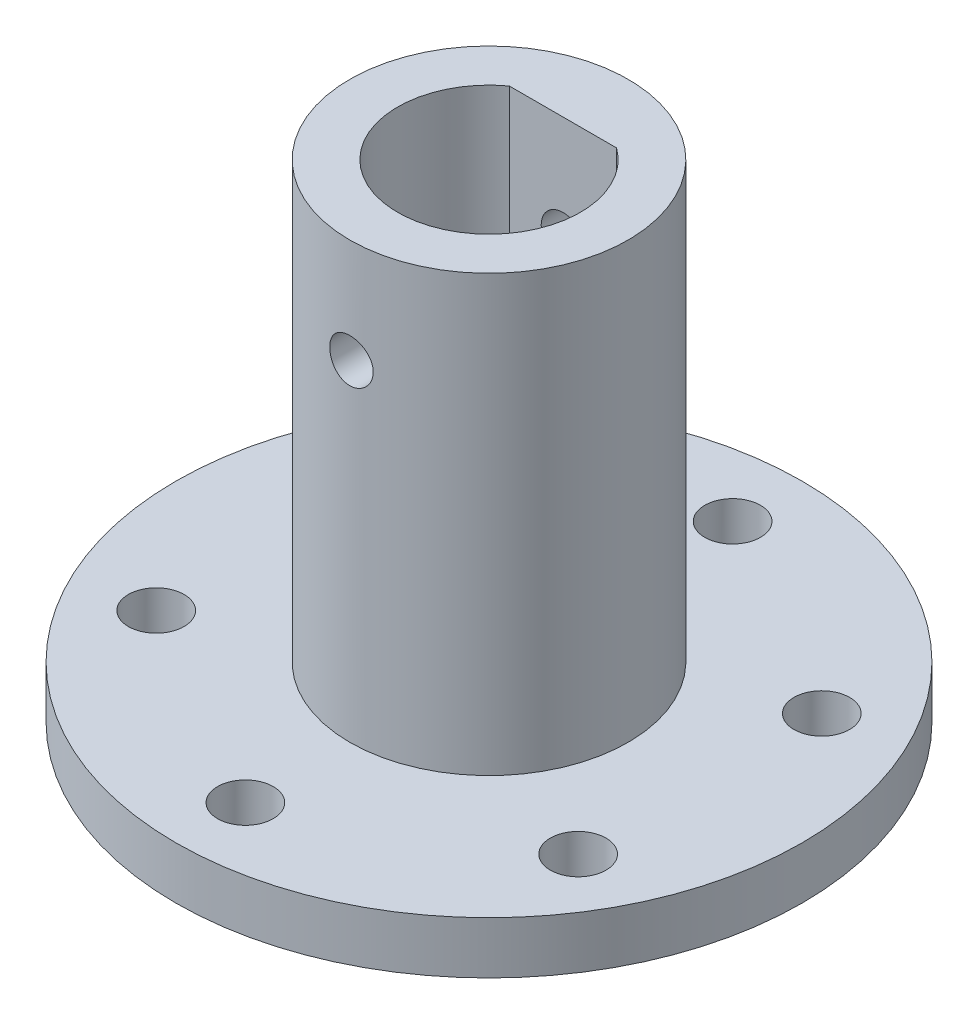
ISO-10303-21;
HEADER;
FILE_DESCRIPTION(('STEP AP214'),'2;1');
FILE_NAME('part.step','',(''),(''),'','','');
FILE_SCHEMA(('AUTOMOTIVE_DESIGN { 1 0 10303 214 1 1 1 1 }'));
ENDSEC;
DATA;
#1=APPLICATION_CONTEXT('core data for automotive mechanical design processes');
#2=APPLICATION_PROTOCOL_DEFINITION('international standard','automotive_design',2000,#1);
#3=PRODUCT_CONTEXT('',#1,'mechanical');
#4=PRODUCT('Part','Part','',(#3));
#5=PRODUCT_RELATED_PRODUCT_CATEGORY('part','',(#4));
#6=PRODUCT_DEFINITION_FORMATION('','',#4);
#7=PRODUCT_DEFINITION_CONTEXT('part definition',#1,'design');
#8=PRODUCT_DEFINITION('design','',#6,#7);
#9=PRODUCT_DEFINITION_SHAPE('','',#8);
#10=(LENGTH_UNIT() NAMED_UNIT(*) SI_UNIT(.MILLI.,.METRE.));
#11=(NAMED_UNIT(*) PLANE_ANGLE_UNIT() SI_UNIT($,.RADIAN.));
#12=(NAMED_UNIT(*) SI_UNIT($,.STERADIAN.) SOLID_ANGLE_UNIT());
#13=UNCERTAINTY_MEASURE_WITH_UNIT(LENGTH_MEASURE(1.E-05),#10,'distance_accuracy_value','');
#14=(GEOMETRIC_REPRESENTATION_CONTEXT(3) GLOBAL_UNCERTAINTY_ASSIGNED_CONTEXT((#13)) GLOBAL_UNIT_ASSIGNED_CONTEXT((#10,
#11,#12)) REPRESENTATION_CONTEXT('',''));
#15=CARTESIAN_POINT('',(0.,0.,0.));
#16=DIRECTION('',(0.,0.,1.));
#17=DIRECTION('',(1.,0.,0.));
#18=AXIS2_PLACEMENT_3D('',#15,#16,#17);
#19=CARTESIAN_POINT('',(0.,12.8439325113563,0.));
#20=DIRECTION('',(0.,1.,0.));
#21=DIRECTION('',(0.,0.,1.));
#22=AXIS2_PLACEMENT_3D('',#19,#20,#21);
#23=CYLINDRICAL_SURFACE('',#22,5.25);
#24=CARTESIAN_POINT('',(-1.24999999999999,22.,5.09901951359279));
#25=CARTESIAN_POINT('',(-1.24999785885748,22.0691367366812,5.09902088312665));
#26=CARTESIAN_POINT('',(-1.24424460502481,22.1382979366956,5.10044097404398));
#27=CARTESIAN_POINT('',(-1.22141569373253,22.2746418867641,5.10595502478239));
#28=CARTESIAN_POINT('',(-1.20433282053127,22.3418233474402,5.11005068862898));
#29=CARTESIAN_POINT('',(-1.15942266716621,22.4722159647704,5.12042632881042));
#30=CARTESIAN_POINT('',(-1.13160842896905,22.5354318328592,5.12670365283029));
#31=CARTESIAN_POINT('',(-1.06606393450019,22.6563047919484,5.14073206322753));
#32=CARTESIAN_POINT('',(-1.02833350066956,22.7139617833866,5.1484831759938));
#33=CARTESIAN_POINT('',(-0.943223109329419,22.8232324282917,5.16475903740231));
#34=CARTESIAN_POINT('',(-0.895681783952359,22.8747187176401,5.17329519422943));
#35=CARTESIAN_POINT('',(-0.792647034494901,22.96906700768,5.19008001857373));
#36=CARTESIAN_POINT('',(-0.737152919242241,23.0119282579953,5.19832866102566));
#37=CARTESIAN_POINT('',(-0.618922605539102,23.0883240871133,5.21373451513865));
#38=CARTESIAN_POINT('',(-0.556104094770733,23.1217345725256,5.22087669359737));
#39=CARTESIAN_POINT('',(-0.42554470351986,23.1774752128776,5.23313524630461));
#40=CARTESIAN_POINT('',(-0.35780448133219,23.1998068465333,5.23825189088664));
#41=CARTESIAN_POINT('',(-0.220651076167159,23.2323508153051,5.24580223262853));
#42=CARTESIAN_POINT('',(-0.151291823574655,23.2427791641291,5.24828369162804));
#43=CARTESIAN_POINT('',(-0.0117669026683149,23.2518975388049,5.25045012977004));
#44=CARTESIAN_POINT('',(0.0583986558104505,23.2505891449427,5.25013548539208));
#45=CARTESIAN_POINT('',(0.196049861550258,23.2364287235743,5.24678109833222));
#46=CARTESIAN_POINT('',(0.263561021569532,23.2238097256917,5.24379636914813));
#47=CARTESIAN_POINT('',(0.3954787610445,23.1877595901311,5.23550067625341));
#48=CARTESIAN_POINT('',(0.459885184145744,23.1643279085537,5.23018959552336));
#49=CARTESIAN_POINT('',(0.584392107067303,23.1071221298941,5.21775208111387));
#50=CARTESIAN_POINT('',(0.644451986255137,23.0732629828094,5.21061080322669));
#51=CARTESIAN_POINT('',(0.758120393347277,22.9962274666705,5.19529092235459));
#52=CARTESIAN_POINT('',(0.811727891330245,22.9530496132396,5.18711215419351));
#53=CARTESIAN_POINT('',(0.912358316897823,22.8573452491013,5.1703744370168));
#54=CARTESIAN_POINT('',(0.959186878562004,22.8046149345126,5.16181108488179));
#55=CARTESIAN_POINT('',(1.04337725172811,22.6919601234376,5.1454551339672));
#56=CARTESIAN_POINT('',(1.08073870091729,22.6320353517438,5.13766256469295));
#57=CARTESIAN_POINT('',(1.14504336945339,22.5063381575573,5.12371620404311));
#58=CARTESIAN_POINT('',(1.17194381298966,22.4405430504215,5.11756917263967));
#59=CARTESIAN_POINT('',(1.21424387111501,22.3051836670014,5.10769895823854));
#60=CARTESIAN_POINT('',(1.22964569002253,22.2356201158823,5.10397531068897));
#61=CARTESIAN_POINT('',(1.2481971982285,22.0964905777367,5.09946992286998));
#62=CARTESIAN_POINT('',(1.2516325382156,22.0269648546118,5.09861960859703));
#63=CARTESIAN_POINT('',(1.2469321889561,21.888333880587,5.099771162733));
#64=CARTESIAN_POINT('',(1.23879745592381,21.8192285954139,5.10177279544141));
#65=CARTESIAN_POINT('',(1.21143734261675,21.6844344220933,5.10833736996044));
#66=CARTESIAN_POINT('',(1.19237468740761,21.6187105006146,5.11286270561253));
#67=CARTESIAN_POINT('',(1.14387857869202,21.4913902483851,5.1239297940766));
#68=CARTESIAN_POINT('',(1.11444398675801,21.4297943716138,5.13047176822569));
#69=CARTESIAN_POINT('',(1.04542931678653,21.3112581266234,5.14498187339137));
#70=CARTESIAN_POINT('',(1.00567640317636,21.2544213283187,5.15297352334474));
#71=CARTESIAN_POINT('',(0.917375042921344,21.1481203354314,5.16942315260144));
#72=CARTESIAN_POINT('',(0.86882529116395,21.0986572368098,5.17788120097065));
#73=CARTESIAN_POINT('',(0.763004603880882,21.0073698092285,5.19454051999405));
#74=CARTESIAN_POINT('',(0.705562297885568,20.9657419741736,5.20273175833321));
#75=CARTESIAN_POINT('',(0.584335590875846,20.8927250616461,5.21773672625508));
#76=CARTESIAN_POINT('',(0.520551510554952,20.8613354667851,5.22455052543991));
#77=CARTESIAN_POINT('',(0.388879861048126,20.8099449619625,5.23599127964168));
#78=CARTESIAN_POINT('',(0.321024383181234,20.7898653405245,5.24063330969237));
#79=CARTESIAN_POINT('',(0.182778339218192,20.7614242197581,5.24727319347292));
#80=CARTESIAN_POINT('',(0.112388216287992,20.7530606820561,5.24927150715531));
#81=CARTESIAN_POINT('',(-0.0270756431727823,20.748394796593,5.25038204287669));
#82=CARTESIAN_POINT('',(-0.09613923562342,20.7518011856621,5.24956396233935));
#83=CARTESIAN_POINT('',(-0.232679577449816,20.7699175171118,5.24528611702384));
#84=CARTESIAN_POINT('',(-0.300156366191006,20.7846271787751,5.24182641785037));
#85=CARTESIAN_POINT('',(-0.431334040661579,20.8247825450282,5.2326626786926));
#86=CARTESIAN_POINT('',(-0.495050440287695,20.8501800208825,5.22696872846421));
#87=CARTESIAN_POINT('',(-0.617352666012316,20.9109454115221,5.21393924600207));
#88=CARTESIAN_POINT('',(-0.675937899517231,20.9463144759321,5.20660352450859));
#89=CARTESIAN_POINT('',(-0.787711991034067,21.0269316531883,5.19088322365525));
#90=CARTESIAN_POINT('',(-0.84075346295058,21.0723803104889,5.18247909165065));
#91=CARTESIAN_POINT('',(-0.938556010634076,21.1714711201647,5.16566363060175));
#92=CARTESIAN_POINT('',(-0.983315030309046,21.2251153010346,5.15725230028973));
#93=CARTESIAN_POINT('',(-1.06400228282944,21.3401397238019,5.14121809211461));
#94=CARTESIAN_POINT('',(-1.09977263989504,21.4016329957493,5.133610511856));
#95=CARTESIAN_POINT('',(-1.16041397113455,21.5299305327622,5.12024517767835));
#96=CARTESIAN_POINT('',(-1.18529339784416,21.5967306314129,5.11448599013699));
#97=CARTESIAN_POINT('',(-1.21944694976979,21.7195762626946,5.10643579215713));
#98=CARTESIAN_POINT('',(-1.23088059691461,21.7750005851223,5.10367460869863));
#99=CARTESIAN_POINT('',(-1.24615773525109,21.8869445361297,5.0999659721163));
#100=CARTESIAN_POINT('',(-1.25000175089899,21.9434640887548,5.09901839366945));
#101=CARTESIAN_POINT('',(-1.24999999999999,22.,5.09901951359279));
#102=B_SPLINE_CURVE_WITH_KNOTS('',3,(#24,#25,#26,#27,#28,#29,#30,#31,#32,#33,#34,#35,#36,#37,
#38,#39,#40,#41,#42,#43,#44,#45,#46,#47,#48,#49,#50,#51,#52,#53,#54,#55,#56,#57,#58,#59,#60,#61,
#62,#63,#64,#65,#66,#67,#68,#69,#70,#71,#72,#73,#74,#75,#76,#77,#78,#79,#80,#81,#82,#83,#84,#85,
#86,#87,#88,#89,#90,#91,#92,#93,#94,#95,#96,#97,#98,#99,#100,#101),.UNSPECIFIED.,.T.,.F.,(4,2,2,
2,2,2,2,2,2,2,2,2,2,2,2,2,2,2,2,2,2,2,2,2,2,2,2,2,2,2,2,2,2,2,2,2,2,2,4),(0.,0.207202765184714,
0.414537623001906,0.621621293782812,0.828708672846365,1.03952115472002,1.25035196930542,
1.46383464640929,1.67728882189395,1.88680449583212,2.09629196009313,2.30156016379188,
2.50683869401434,2.71383799549589,2.92087029426312,3.13299433877604,3.34512650019262,
3.55811718660246,3.7710670316113,3.97889736743139,4.18671052801054,4.3915067218453,
4.59632540119041,4.80482526343989,5.0133560844185,5.2265699873704,5.43977311391033,
5.65147352089867,5.86313709150271,6.0696006573055,6.27605909574461,6.4815957153281,
6.6871560409301,6.89724669770571,7.10738943904514,7.32099917179347,7.53444282516285,
7.70389263250655,7.87333073017472),.UNSPECIFIED.);
#103=CARTESIAN_POINT('',(-1.24999999999999,22.,5.09901951359279));
#104=VERTEX_POINT('',#103);
#105=EDGE_CURVE('E87',#104,#104,#102,.T.);
#106=ORIENTED_EDGE('',*,*,#105,.F.);
#107=EDGE_LOOP('',(#106));
#108=FACE_BOUND('',#107,.T.);
#109=DIRECTION('',(0.,1.,0.));
#110=VECTOR('',#109,1.);
#111=CARTESIAN_POINT('',(3.08220700148449,-6.2449979983984,-4.25));
#112=LINE('',#111,#110);
#113=CARTESIAN_POINT('',(3.08220700148449,0.,-4.25));
#114=VERTEX_POINT('',#113);
#115=CARTESIAN_POINT('',(3.08220700148449,28.,-4.25));
#116=VERTEX_POINT('',#115);
#117=EDGE_CURVE('E61',#114,#116,#112,.T.);
#118=ORIENTED_EDGE('',*,*,#117,.F.);
#119=CARTESIAN_POINT('',(0.,0.,0.));
#120=DIRECTION('',(0.,1.,0.));
#121=DIRECTION('',(0.,0.,1.));
#122=AXIS2_PLACEMENT_3D('',#119,#120,#121);
#123=CIRCLE('',#122,5.25);
#124=CARTESIAN_POINT('',(-3.08220700148449,0.,-4.25));
#125=VERTEX_POINT('',#124);
#126=EDGE_CURVE('E11',#125,#114,#123,.T.);
#127=ORIENTED_EDGE('',*,*,#126,.F.);
#128=DIRECTION('',(0.,1.,0.));
#129=VECTOR('',#128,1.);
#130=CARTESIAN_POINT('',(-3.08220700148449,-6.2449979983984,-4.25));
#131=LINE('',#130,#129);
#132=CARTESIAN_POINT('',(-3.08220700148449,28.,-4.25));
#133=VERTEX_POINT('',#132);
#134=EDGE_CURVE('E76',#125,#133,#131,.T.);
#135=ORIENTED_EDGE('',*,*,#134,.T.);
#136=CARTESIAN_POINT('',(0.,28.,0.));
#137=DIRECTION('',(0.,1.,0.));
#138=DIRECTION('',(0.,0.,1.));
#139=AXIS2_PLACEMENT_3D('',#136,#137,#138);
#140=CIRCLE('',#139,5.25);
#141=EDGE_CURVE('E68',#133,#116,#140,.T.);
#142=ORIENTED_EDGE('',*,*,#141,.T.);
#143=EDGE_LOOP('',(#118,#127,#135,#142));
#144=FACE_BOUND('',#143,.T.);
#145=ADVANCED_FACE('F36',(#108,#144),#23,.F.);
#146=CARTESIAN_POINT('',(-5.25,0.,0.));
#147=DIRECTION('',(0.,-1.,0.));
#148=DIRECTION('',(0.,0.,-1.));
#149=AXIS2_PLACEMENT_3D('',#146,#147,#148);
#150=PLANE('',#149);
#151=CARTESIAN_POINT('',(12.1243556529821,0.,-7.));
#152=DIRECTION('',(0.,-1.,0.));
#153=DIRECTION('',(0.,0.,-1.));
#154=AXIS2_PLACEMENT_3D('',#151,#152,#153);
#155=CIRCLE('',#154,1.6);
#156=CARTESIAN_POINT('',(12.1243556529821,0.,-8.60000000000001));
#157=VERTEX_POINT('',#156);
#158=EDGE_CURVE('E118',#157,#157,#155,.T.);
#159=ORIENTED_EDGE('',*,*,#158,.F.);
#160=EDGE_LOOP('',(#159));
#161=FACE_BOUND('',#160,.T.);
#162=CARTESIAN_POINT('',(12.1243556529821,0.,7.));
#163=DIRECTION('',(0.,-1.,0.));
#164=DIRECTION('',(0.,0.,-1.));
#165=AXIS2_PLACEMENT_3D('',#162,#163,#164);
#166=CIRCLE('',#165,1.6);
#167=CARTESIAN_POINT('',(12.1243556529821,0.,5.4));
#168=VERTEX_POINT('',#167);
#169=EDGE_CURVE('E115',#168,#168,#166,.T.);
#170=ORIENTED_EDGE('',*,*,#169,.F.);
#171=EDGE_LOOP('',(#170));
#172=FACE_BOUND('',#171,.T.);
#173=CARTESIAN_POINT('',(0.,0.,14.));
#174=DIRECTION('',(0.,-1.,0.));
#175=DIRECTION('',(0.,0.,-1.));
#176=AXIS2_PLACEMENT_3D('',#173,#174,#175);
#177=CIRCLE('',#176,1.6);
#178=CARTESIAN_POINT('',(0.,0.,12.4));
#179=VERTEX_POINT('',#178);
#180=EDGE_CURVE('E112',#179,#179,#177,.T.);
#181=ORIENTED_EDGE('',*,*,#180,.F.);
#182=EDGE_LOOP('',(#181));
#183=FACE_BOUND('',#182,.T.);
#184=CARTESIAN_POINT('',(-12.1243556529821,0.,7.00000000000001));
#185=DIRECTION('',(0.,-1.,0.));
#186=DIRECTION('',(0.,0.,-1.));
#187=AXIS2_PLACEMENT_3D('',#184,#185,#186);
#188=CIRCLE('',#187,1.6);
#189=CARTESIAN_POINT('',(-12.1243556529821,0.,5.4));
#190=VERTEX_POINT('',#189);
#191=EDGE_CURVE('E109',#190,#190,#188,.T.);
#192=ORIENTED_EDGE('',*,*,#191,.F.);
#193=EDGE_LOOP('',(#192));
#194=FACE_BOUND('',#193,.T.);
#195=CARTESIAN_POINT('',(-12.1243556529821,0.,-6.99999999999999));
#196=DIRECTION('',(0.,-1.,0.));
#197=DIRECTION('',(0.,0.,-1.));
#198=AXIS2_PLACEMENT_3D('',#195,#196,#197);
#199=CIRCLE('',#198,1.6);
#200=CARTESIAN_POINT('',(-12.1243556529821,0.,-8.59999999999999));
#201=VERTEX_POINT('',#200);
#202=EDGE_CURVE('E95',#201,#201,#199,.T.);
#203=ORIENTED_EDGE('',*,*,#202,.F.);
#204=EDGE_LOOP('',(#203));
#205=FACE_BOUND('',#204,.T.);
#206=CARTESIAN_POINT('',(0.,0.,-14.));
#207=DIRECTION('',(0.,-1.,0.));
#208=DIRECTION('',(0.,0.,-1.));
#209=AXIS2_PLACEMENT_3D('',#206,#207,#208);
#210=CIRCLE('',#209,1.6);
#211=CARTESIAN_POINT('',(0.,0.,-15.6));
#212=VERTEX_POINT('',#211);
#213=EDGE_CURVE('E73',#212,#212,#210,.T.);
#214=ORIENTED_EDGE('',*,*,#213,.F.);
#215=EDGE_LOOP('',(#214));
#216=FACE_BOUND('',#215,.T.);
#217=ORIENTED_EDGE('',*,*,#126,.T.);
#218=DIRECTION('',(1.,0.,0.));
#219=VECTOR('',#218,1.);
#220=CARTESIAN_POINT('',(-3.08220700148449,0.,-4.25));
#221=LINE('',#220,#219);
#222=EDGE_CURVE('E82',#125,#114,#221,.T.);
#223=ORIENTED_EDGE('',*,*,#222,.F.);
#224=EDGE_LOOP('',(#217,#223));
#225=FACE_BOUND('',#224,.T.);
#226=CARTESIAN_POINT('',(0.,0.,0.));
#227=DIRECTION('',(0.,1.,0.));
#228=DIRECTION('',(0.,0.,1.));
#229=AXIS2_PLACEMENT_3D('',#226,#227,#228);
#230=CIRCLE('',#229,18.);
#231=CARTESIAN_POINT('',(0.,0.,18.));
#232=VERTEX_POINT('',#231);
#233=EDGE_CURVE('E50',#232,#232,#230,.T.);
#234=ORIENTED_EDGE('',*,*,#233,.F.);
#235=EDGE_LOOP('',(#234));
#236=FACE_BOUND('',#235,.T.);
#237=ADVANCED_FACE('F180',(#161,#172,#183,#194,#205,#216,#225,#236),#150,.T.);
#238=CARTESIAN_POINT('',(0.,12.8439325113563,0.));
#239=DIRECTION('',(0.,1.,0.));
#240=DIRECTION('',(0.,0.,1.));
#241=AXIS2_PLACEMENT_3D('',#238,#239,#240);
#242=CYLINDRICAL_SURFACE('',#241,18.);
#243=ORIENTED_EDGE('',*,*,#233,.T.);
#244=EDGE_LOOP('',(#243));
#245=FACE_BOUND('',#244,.T.);
#246=CARTESIAN_POINT('',(0.,3.,0.));
#247=DIRECTION('',(0.,1.,0.));
#248=DIRECTION('',(0.,0.,1.));
#249=AXIS2_PLACEMENT_3D('',#246,#247,#248);
#250=CIRCLE('',#249,18.);
#251=CARTESIAN_POINT('',(0.,3.,18.));
#252=VERTEX_POINT('',#251);
#253=EDGE_CURVE('E131',#252,#252,#250,.T.);
#254=ORIENTED_EDGE('',*,*,#253,.F.);
#255=EDGE_LOOP('',(#254));
#256=FACE_BOUND('',#255,.T.);
#257=ADVANCED_FACE('F185',(#245,#256),#242,.T.);
#258=CARTESIAN_POINT('',(-18.,3.,0.));
#259=DIRECTION('',(0.,1.,0.));
#260=DIRECTION('',(0.,0.,1.));
#261=AXIS2_PLACEMENT_3D('',#258,#259,#260);
#262=PLANE('',#261);
#263=CARTESIAN_POINT('',(12.1243556529821,3.,-7.));
#264=DIRECTION('',(0.,1.,0.));
#265=DIRECTION('',(0.,0.,1.));
#266=AXIS2_PLACEMENT_3D('',#263,#264,#265);
#267=CIRCLE('',#266,1.6);
#268=CARTESIAN_POINT('',(12.1243556529821,3.,-5.4));
#269=VERTEX_POINT('',#268);
#270=EDGE_CURVE('E92',#269,#269,#267,.T.);
#271=ORIENTED_EDGE('',*,*,#270,.F.);
#272=EDGE_LOOP('',(#271));
#273=FACE_BOUND('',#272,.T.);
#274=CARTESIAN_POINT('',(12.1243556529821,3.,7.));
#275=DIRECTION('',(0.,1.,0.));
#276=DIRECTION('',(0.,0.,1.));
#277=AXIS2_PLACEMENT_3D('',#274,#275,#276);
#278=CIRCLE('',#277,1.6);
#279=CARTESIAN_POINT('',(12.1243556529821,3.,8.6));
#280=VERTEX_POINT('',#279);
#281=EDGE_CURVE('E96',#280,#280,#278,.T.);
#282=ORIENTED_EDGE('',*,*,#281,.F.);
#283=EDGE_LOOP('',(#282));
#284=FACE_BOUND('',#283,.T.);
#285=CARTESIAN_POINT('',(0.,3.,14.));
#286=DIRECTION('',(0.,1.,0.));
#287=DIRECTION('',(0.,0.,1.));
#288=AXIS2_PLACEMENT_3D('',#285,#286,#287);
#289=CIRCLE('',#288,1.6);
#290=CARTESIAN_POINT('',(0.,3.,15.6));
#291=VERTEX_POINT('',#290);
#292=EDGE_CURVE('E99',#291,#291,#289,.T.);
#293=ORIENTED_EDGE('',*,*,#292,.F.);
#294=EDGE_LOOP('',(#293));
#295=FACE_BOUND('',#294,.T.);
#296=CARTESIAN_POINT('',(-12.1243556529821,3.,7.00000000000001));
#297=DIRECTION('',(0.,1.,0.));
#298=DIRECTION('',(0.,0.,1.));
#299=AXIS2_PLACEMENT_3D('',#296,#297,#298);
#300=CIRCLE('',#299,1.6);
#301=CARTESIAN_POINT('',(-12.1243556529821,3.,8.60000000000001));
#302=VERTEX_POINT('',#301);
#303=EDGE_CURVE('E102',#302,#302,#300,.T.);
#304=ORIENTED_EDGE('',*,*,#303,.F.);
#305=EDGE_LOOP('',(#304));
#306=FACE_BOUND('',#305,.T.);
#307=CARTESIAN_POINT('',(-12.1243556529821,3.,-6.99999999999999));
#308=DIRECTION('',(0.,1.,0.));
#309=DIRECTION('',(0.,0.,1.));
#310=AXIS2_PLACEMENT_3D('',#307,#308,#309);
#311=CIRCLE('',#310,1.6);
#312=CARTESIAN_POINT('',(-12.1243556529821,3.,-5.39999999999999));
#313=VERTEX_POINT('',#312);
#314=EDGE_CURVE('E79',#313,#313,#311,.T.);
#315=ORIENTED_EDGE('',*,*,#314,.F.);
#316=EDGE_LOOP('',(#315));
#317=FACE_BOUND('',#316,.T.);
#318=CARTESIAN_POINT('',(0.,3.,-14.));
#319=DIRECTION('',(0.,1.,0.));
#320=DIRECTION('',(0.,0.,1.));
#321=AXIS2_PLACEMENT_3D('',#318,#319,#320);
#322=CIRCLE('',#321,1.6);
#323=CARTESIAN_POINT('',(0.,3.,-12.4));
#324=VERTEX_POINT('',#323);
#325=EDGE_CURVE('E121',#324,#324,#322,.T.);
#326=ORIENTED_EDGE('',*,*,#325,.F.);
#327=EDGE_LOOP('',(#326));
#328=FACE_BOUND('',#327,.T.);
#329=ORIENTED_EDGE('',*,*,#253,.T.);
#330=EDGE_LOOP('',(#329));
#331=FACE_BOUND('',#330,.T.);
#332=CARTESIAN_POINT('',(0.,3.,0.));
#333=DIRECTION('',(0.,1.,0.));
#334=DIRECTION('',(0.,0.,1.));
#335=AXIS2_PLACEMENT_3D('',#332,#333,#334);
#336=CIRCLE('',#335,8.);
#337=CARTESIAN_POINT('',(0.,3.,8.));
#338=VERTEX_POINT('',#337);
#339=EDGE_CURVE('E128',#338,#338,#336,.T.);
#340=ORIENTED_EDGE('',*,*,#339,.F.);
#341=EDGE_LOOP('',(#340));
#342=FACE_BOUND('',#341,.T.);
#343=ADVANCED_FACE('F164',(#273,#284,#295,#306,#317,#328,#331,#342),#262,.T.);
#344=CARTESIAN_POINT('',(0.,12.8439325113563,0.));
#345=DIRECTION('',(0.,1.,0.));
#346=DIRECTION('',(0.,0.,1.));
#347=AXIS2_PLACEMENT_3D('',#344,#345,#346);
#348=CYLINDRICAL_SURFACE('',#347,8.);
#349=CARTESIAN_POINT('',(0.,20.75,8.));
#350=CARTESIAN_POINT('',(0.0697575486355159,20.7500028491358,7.99999885097241));
#351=CARTESIAN_POINT('',(0.139554702432851,20.7558590568868,7.9990780624287));
#352=CARTESIAN_POINT('',(0.277195657489049,20.7791218456384,7.99549349048796));
#353=CARTESIAN_POINT('',(0.345037530661656,20.7965394462518,7.99282804422361));
#354=CARTESIAN_POINT('',(0.476756269023698,20.8423898314033,7.98605348582888));
#355=CARTESIAN_POINT('',(0.540636176144947,20.8708140406808,7.98194549781586));
#356=CARTESIAN_POINT('',(0.662710625522294,20.9378492725708,7.97273897019077));
#357=CARTESIAN_POINT('',(0.720905905184149,20.976458971518,7.96764055931276));
#358=CARTESIAN_POINT('',(0.830459955825802,21.063116524177,7.95697134207178));
#359=CARTESIAN_POINT('',(0.881763739571314,21.1112334974451,7.95139725696168));
#360=CARTESIAN_POINT('',(0.975603844114107,21.2153909741344,7.94043038065143));
#361=CARTESIAN_POINT('',(1.01813964327095,21.2714319486501,7.93503760025374));
#362=CARTESIAN_POINT('',(1.09345272164441,21.3902191356719,7.92501214063722));
#363=CARTESIAN_POINT('',(1.12617636778995,21.4529997411809,7.92038369893052));
#364=CARTESIAN_POINT('',(1.18059340798532,21.5832507054289,7.91245600871182));
#365=CARTESIAN_POINT('',(1.20228745505031,21.6507207862553,7.90915668151108));
#366=CARTESIAN_POINT('',(1.23385779661083,21.7878554505719,7.90429317255518));
#367=CARTESIAN_POINT('',(1.24382852743747,21.8574977929094,7.90271513266182));
#368=CARTESIAN_POINT('',(1.2519618487881,21.9974835944463,7.90143085535887));
#369=CARTESIAN_POINT('',(1.25012517430232,22.067827009733,7.90172450144011));
#370=CARTESIAN_POINT('',(1.23477290404444,22.2065485159263,7.90413775227603));
#371=CARTESIAN_POINT('',(1.22136281479846,22.2749386116766,7.90624086092473));
#372=CARTESIAN_POINT('',(1.18340968916875,22.4084860031797,7.91201028172736));
#373=CARTESIAN_POINT('',(1.15886631342065,22.4736432003203,7.91567664153206));
#374=CARTESIAN_POINT('',(1.09923458474691,22.5991943563386,7.92417753427311));
#375=CARTESIAN_POINT('',(1.06410186157774,22.6595668958865,7.92901696543622));
#376=CARTESIAN_POINT('',(0.984320290733181,22.7735997678428,7.93931523075049));
#377=CARTESIAN_POINT('',(0.939670766265078,22.8272596224437,7.94477410894106));
#378=CARTESIAN_POINT('',(0.841545444111659,22.9269551233166,7.95576893124448));
#379=CARTESIAN_POINT('',(0.78797900280269,22.9729015791347,7.96130506817796));
#380=CARTESIAN_POINT('',(0.673848473689675,23.0551665728199,7.97177562673913));
#381=CARTESIAN_POINT('',(0.613284350340655,23.0914850617784,7.97671004531012));
#382=CARTESIAN_POINT('',(0.486797963528242,23.1534690367112,7.98542699513518));
#383=CARTESIAN_POINT('',(0.420872093120226,23.1791272792665,7.98920874270966));
#384=CARTESIAN_POINT('',(0.285574767348376,23.2189829837236,7.99518780000338));
#385=CARTESIAN_POINT('',(0.216203565343598,23.2331812870332,7.99738522604488));
#386=CARTESIAN_POINT('',(0.0767541683818668,23.2495946382251,7.99993255863639));
#387=CARTESIAN_POINT('',(0.00669073075435062,23.2519322394881,8.0003013589643));
#388=CARTESIAN_POINT('',(-0.13282727320582,23.244883647332,7.99920143245634));
#389=CARTESIAN_POINT('',(-0.202281859962576,23.2354978487054,7.99773276749821));
#390=CARTESIAN_POINT('',(-0.338236723132849,23.2053708061599,7.99313461846611));
#391=CARTESIAN_POINT('',(-0.404750631028017,23.1846896208661,7.99001392107693));
#392=CARTESIAN_POINT('',(-0.533367033928308,23.1326224528006,7.98246037841779));
#393=CARTESIAN_POINT('',(-0.595469306519699,23.1012359307787,7.97802746705036));
#394=CARTESIAN_POINT('',(-0.714036101125198,23.0283640044367,7.96829486370472));
#395=CARTESIAN_POINT('',(-0.770452561891856,22.9868012899548,7.9629886433171));
#396=CARTESIAN_POINT('',(-0.875553482539024,22.8948639570461,7.95211940232218));
#397=CARTESIAN_POINT('',(-0.924237452235083,22.8444887803976,7.94655636546338));
#398=CARTESIAN_POINT('',(-1.01294040388345,22.7358094013914,7.93574013768325));
#399=CARTESIAN_POINT('',(-1.05287699292062,22.6774375764388,7.93049020595401));
#400=CARTESIAN_POINT('',(-1.12237783863319,22.5547419631693,7.92095346402913));
#401=CARTESIAN_POINT('',(-1.15194239389051,22.4904183462553,7.91666662610998));
#402=CARTESIAN_POINT('',(-1.19973385972496,22.3578851796429,7.90956535676178));
#403=CARTESIAN_POINT('',(-1.21800327473955,22.2896912656172,7.9067454117448));
#404=CARTESIAN_POINT('',(-1.24282061020267,22.151155428168,7.90288285140397));
#405=CARTESIAN_POINT('',(-1.24936941542498,22.0808136672905,7.9018401019222));
#406=CARTESIAN_POINT('',(-1.25053726345377,21.9408006420463,7.90165529022442));
#407=CARTESIAN_POINT('',(-1.24528590274212,21.8711304515333,7.90249258021451));
#408=CARTESIAN_POINT('',(-1.2232811162795,21.7336773514279,7.90592849470915));
#409=CARTESIAN_POINT('',(-1.2065277154348,21.6658944377491,7.90852711539975));
#410=CARTESIAN_POINT('',(-1.16204164945925,21.5341810866797,7.91518544427452));
#411=CARTESIAN_POINT('',(-1.1343188086929,21.4702472608708,7.91924384476704));
#412=CARTESIAN_POINT('',(-1.06869384273208,21.3479171931619,7.92836592023698));
#413=CARTESIAN_POINT('',(-1.03079131410442,21.2895211708558,7.93342963505413));
#414=CARTESIAN_POINT('',(-0.945415040695393,21.1792672279366,7.9440578404613));
#415=CARTESIAN_POINT('',(-0.897845535473837,21.1274839016931,7.94962700580145));
#416=CARTESIAN_POINT('',(-0.794687973191015,21.0325893818066,7.96060021820366));
#417=CARTESIAN_POINT('',(-0.739098060392156,20.9894802007041,7.96600422670061));
#418=CARTESIAN_POINT('',(-0.621083429421701,20.9129243884842,7.9760755122835));
#419=CARTESIAN_POINT('',(-0.558619686071186,20.8795373136202,7.98073817215134));
#420=CARTESIAN_POINT('',(-0.428925941178889,20.8237795019035,7.9887562991944));
#421=CARTESIAN_POINT('',(-0.361700888290879,20.8013975137208,7.9921131007106));
#422=CARTESIAN_POINT('',(-0.245157119955795,20.7732834894547,7.9963872293244));
#423=CARTESIAN_POINT('',(-0.196552787825811,20.7645657546855,7.99773495813061));
#424=CARTESIAN_POINT('',(-0.0986388989252902,20.7529230433105,7.9995417434881));
#425=CARTESIAN_POINT('',(-0.0493293520845589,20.7499979852213,8.00000081253982));
#426=CARTESIAN_POINT('',(0.,20.75,8.));
#427=B_SPLINE_CURVE_WITH_KNOTS('',3,(#349,#350,#351,#352,#353,#354,#355,#356,#357,#358,#359,
#360,#361,#362,#363,#364,#365,#366,#367,#368,#369,#370,#371,#372,#373,#374,#375,#376,#377,#378,
#379,#380,#381,#382,#383,#384,#385,#386,#387,#388,#389,#390,#391,#392,#393,#394,#395,#396,#397,
#398,#399,#400,#401,#402,#403,#404,#405,#406,#407,#408,#409,#410,#411,#412,#413,#414,#415,#416,
#417,#418,#419,#420,#421,#422,#423,#424,#425,#426),.UNSPECIFIED.,.T.,.F.,(4,2,2,2,2,2,2,2,2,2,2,
2,2,2,2,2,2,2,2,2,2,2,2,2,2,2,2,2,2,2,2,2,2,2,2,2,2,2,4),(0.,0.209092370238744,
0.418384321264004,0.627513539720509,0.836615593960144,1.04729784076099,1.2579926182271,
1.46981889302878,1.68163262504618,1.89172815567496,2.10181060835271,2.30999788011288,
2.51819149825524,2.72726988701171,2.93636314946032,3.14772866167181,3.35909524756911,
3.5706052187728,3.7820996591493,3.99140427002954,4.20070183264175,4.4088972237828,
4.61710310371012,4.82694270734832,5.03679560800704,5.24854740124792,5.46029309824486,
5.67123705197561,5.88216508114644,6.09078790799341,6.29941028309444,6.50784623483304,
6.71629044835669,6.92691006157765,7.13757848571145,7.34951152099916,7.56122742828135,
7.70909008175764,7.85695065529349),.UNSPECIFIED.);
#428=CARTESIAN_POINT('',(0.,20.75,8.));
#429=VERTEX_POINT('',#428);
#430=EDGE_CURVE('E40',#429,#429,#427,.T.);
#431=ORIENTED_EDGE('',*,*,#430,.F.);
#432=EDGE_LOOP('',(#431));
#433=FACE_BOUND('',#432,.T.);
#434=CARTESIAN_POINT('',(-1.24999999999999,22.,-7.90174031463955));
#435=CARTESIAN_POINT('',(-1.24999714589601,22.0697516891636,-7.90174151747695));
#436=CARTESIAN_POINT('',(-1.2441418887143,22.1395429988222,-7.90267390208986));
#437=CARTESIAN_POINT('',(-1.22088321822909,22.2771718144826,-7.90629985526833));
#438=CARTESIAN_POINT('',(-1.20346876400911,22.3450073877359,-7.90899510762377));
#439=CARTESIAN_POINT('',(-1.1576275802342,22.4767127948288,-7.91583424559868));
#440=CARTESIAN_POINT('',(-1.12920957460921,22.5405857239372,-7.919976983357));
#441=CARTESIAN_POINT('',(-1.06218895908233,22.6626484454193,-7.92924294913634));
#442=CARTESIAN_POINT('',(-1.02358765802571,22.7208389668293,-7.93436605112924));
#443=CARTESIAN_POINT('',(-0.93693865055444,22.8303982425761,-7.94506519257156));
#444=CARTESIAN_POINT('',(-0.888819943087462,22.8817105371999,-7.95064443921898));
#445=CARTESIAN_POINT('',(-0.784655404938381,22.9755671102148,-7.96159865413737));
#446=CARTESIAN_POINT('',(-0.728609126584247,23.0181108931121,-7.96697361085027));
#447=CARTESIAN_POINT('',(-0.609817145928798,23.0934324385206,-7.97694733576469));
#448=CARTESIAN_POINT('',(-0.547037963178643,23.1261580019872,-7.98154190081689));
#449=CARTESIAN_POINT('',(-0.416790085897381,23.1805789773625,-7.98940157455279));
#450=CARTESIAN_POINT('',(-0.349321660068407,23.2022750206913,-7.99266675933897));
#451=CARTESIAN_POINT('',(-0.212192662724408,23.2338493594781,-7.99747714289859));
#452=CARTESIAN_POINT('',(-0.142554380080379,23.2438223245342,-7.99903611302522));
#453=CARTESIAN_POINT('',(-0.0025765717753397,23.2519615216517,-8.00030565490476));
#454=CARTESIAN_POINT('',(0.0677629114945889,23.2501284631759,-8.00001633772735));
#455=CARTESIAN_POINT('',(0.206500044861071,23.2347820368611,-7.99763286949342));
#456=CARTESIAN_POINT('',(0.274909271287582,23.2213705305798,-7.99555445847991));
#457=CARTESIAN_POINT('',(0.40849418767174,23.1834079856887,-7.98984386977642));
#458=CARTESIAN_POINT('',(0.473669788676081,23.1588566408229,-7.98621164936935));
#459=CARTESIAN_POINT('',(0.599243713396228,23.09920817207,-7.97777459210141));
#460=CARTESIAN_POINT('',(0.659621495359176,23.064068497286,-7.97296503885208));
#461=CARTESIAN_POINT('',(0.773661928266057,22.9842719596854,-7.96270873510231));
#462=CARTESIAN_POINT('',(0.82732409979661,22.9396144180225,-7.95726193916408));
#463=CARTESIAN_POINT('',(0.927010992600107,22.8414832564634,-7.94626939127781));
#464=CARTESIAN_POINT('',(0.972948128065364,22.7879206668026,-7.94072320355105));
#465=CARTESIAN_POINT('',(1.05519613023742,22.6738012176589,-7.93021346922373));
#466=CARTESIAN_POINT('',(1.09150692769167,22.613244307863,-7.92524992681491));
#467=CARTESIAN_POINT('',(1.15348530317842,22.4867601859471,-7.91646746408067));
#468=CARTESIAN_POINT('',(1.17914331942079,22.4208282124633,-7.91264957292446));
#469=CARTESIAN_POINT('',(1.21899671563833,22.2855175756473,-7.9066084495474));
#470=CARTESIAN_POINT('',(1.23319297597628,22.2161391774651,-7.90438509485371));
#471=CARTESIAN_POINT('',(1.24959859618927,22.0766859483624,-7.90180818484429));
#472=CARTESIAN_POINT('',(1.25193236705635,22.0066260999026,-7.90143522402998));
#473=CARTESIAN_POINT('',(1.24487739516591,21.867116182351,-7.9025497488591));
#474=CARTESIAN_POINT('',(1.23548904827163,21.7976660927471,-7.90403717167621));
#475=CARTESIAN_POINT('',(1.20536206277947,21.6617360962668,-7.90868700525928));
#476=CARTESIAN_POINT('',(1.18468589390989,21.5952420006802,-7.91184019416676));
#477=CARTESIAN_POINT('',(1.13263536120965,21.4666630144481,-7.91945862198424));
#478=CARTESIAN_POINT('',(1.10126042801474,21.4045783586755,-7.92392393072055));
#479=CARTESIAN_POINT('',(1.02840599585146,21.2860243591756,-7.93370896103555));
#480=CARTESIAN_POINT('',(0.986846255467352,21.22960488555,-7.93903534729881));
#481=CARTESIAN_POINT('',(0.894912969976411,21.1244965095759,-7.94992252348104));
#482=CARTESIAN_POINT('',(0.844538882607101,21.0758080831965,-7.95548332780552));
#483=CARTESIAN_POINT('',(0.73585773382904,20.9870943646823,-7.96627369437276));
#484=CARTESIAN_POINT('',(0.677482820794918,20.947151711785,-7.97149979210822));
#485=CARTESIAN_POINT('',(0.554779305146687,20.8776402400049,-7.98097744670418));
#486=CARTESIAN_POINT('',(0.490450876581246,20.848071117977,-7.98522903204154));
#487=CARTESIAN_POINT('',(0.357919831889164,20.8002768623579,-7.99226348838417));
#488=CARTESIAN_POINT('',(0.289733573808545,20.7820072512803,-7.9950521112786));
#489=CARTESIAN_POINT('',(0.151213974885376,20.7571869336636,-7.99887064894726));
#490=CARTESIAN_POINT('',(0.0808807888272196,20.750635384322,-7.99990069020437));
#491=CARTESIAN_POINT('',(-0.0591360825941335,20.7494590736724,-8.00008455063986));
#492=CARTESIAN_POINT('',(-0.128818714429895,20.7547081276786,-7.99925822019993));
#493=CARTESIAN_POINT('',(-0.26629729773243,20.7767126580902,-7.9958623900713));
#494=CARTESIAN_POINT('',(-0.334093256790792,20.7934680881892,-7.99329289739778));
#495=CARTESIAN_POINT('',(-0.465834425214719,20.8379636298562,-7.98669820710743));
#496=CARTESIAN_POINT('',(-0.529782898258207,20.8656942757906,-7.98267426414775));
#497=CARTESIAN_POINT('',(-0.652139036265998,20.9313394192608,-7.97361166155728));
#498=CARTESIAN_POINT('',(-0.710546490726952,20.9692543034864,-7.96857296339862));
#499=CARTESIAN_POINT('',(-0.820801095929344,21.0546447216049,-7.9579764111196));
#500=CARTESIAN_POINT('',(-0.872575847413238,21.1022131571545,-7.95241381770964));
#501=CARTESIAN_POINT('',(-0.967453563683481,21.2053649786652,-7.94143064388637));
#502=CARTESIAN_POINT('',(-1.0105544928104,21.260950240853,-7.936010097069));
#503=CARTESIAN_POINT('',(-1.08710075771187,21.3789605521457,-7.92588898732018));
#504=CARTESIAN_POINT('',(-1.12048522074143,21.4414254793371,-7.92119304654734));
#505=CARTESIAN_POINT('',(-1.17623782803743,21.5711216088476,-7.91310716729583));
#506=CARTESIAN_POINT('',(-1.19861725029601,21.6383478505669,-7.90971589257156));
#507=CARTESIAN_POINT('',(-1.22672453478633,21.7548848698436,-7.90539548341694));
#508=CARTESIAN_POINT('',(-1.23543924637685,21.8034807999906,-7.90403218990728));
#509=CARTESIAN_POINT('',(-1.2470779453941,21.901377890525,-7.90220418687746));
#510=CARTESIAN_POINT('',(-1.2500020181181,21.9506790405134,-7.90173946412116));
#511=CARTESIAN_POINT('',(-1.24999999999999,22.,-7.90174031463955));
#512=B_SPLINE_CURVE_WITH_KNOTS('',3,(#434,#435,#436,#437,#438,#439,#440,#441,#442,#443,#444,
#445,#446,#447,#448,#449,#450,#451,#452,#453,#454,#455,#456,#457,#458,#459,#460,#461,#462,#463,
#464,#465,#466,#467,#468,#469,#470,#471,#472,#473,#474,#475,#476,#477,#478,#479,#480,#481,#482,
#483,#484,#485,#486,#487,#488,#489,#490,#491,#492,#493,#494,#495,#496,#497,#498,#499,#500,#501,
#502,#503,#504,#505,#506,#507,#508,#509,#510,#511),.UNSPECIFIED.,.T.,.F.,(4,2,2,2,2,2,2,2,2,2,2,
2,2,2,2,2,2,2,2,2,2,2,2,2,2,2,2,2,2,2,2,2,2,2,2,2,2,2,4),(0.,0.20907476394129,0.418349516267955,
0.627458688206178,0.83654099670703,1.04724629023634,1.25796348710332,1.46978189009238,
1.68158816549377,1.89167198756849,2.10174318513253,2.30998489573483,2.51823233165378,
2.72732806463506,2.93643871601871,3.14778021695734,3.35912323826017,3.57065555017414,
3.78217161301615,3.99146470015319,4.20075071952321,4.40889006724109,4.61704049339767,
4.82688676416578,5.03674594931011,5.2485098599773,5.46026758176483,5.67118638114208,
5.88209000991813,6.09074917034589,6.29940749105,6.50788624405676,6.71637291400436,
6.92697020198993,7.13761685756285,7.34955610829274,7.56127770816937,7.70911527287127,
7.85695065987998),.UNSPECIFIED.);
#513=CARTESIAN_POINT('',(-1.24999999999999,22.,-7.90174031463955));
#514=VERTEX_POINT('',#513);
#515=EDGE_CURVE('E135',#514,#514,#512,.T.);
#516=ORIENTED_EDGE('',*,*,#515,.F.);
#517=EDGE_LOOP('',(#516));
#518=FACE_BOUND('',#517,.T.);
#519=ORIENTED_EDGE('',*,*,#339,.T.);
#520=EDGE_LOOP('',(#519));
#521=FACE_BOUND('',#520,.T.);
#522=CARTESIAN_POINT('',(0.,28.,0.));
#523=DIRECTION('',(0.,1.,0.));
#524=DIRECTION('',(0.,0.,1.));
#525=AXIS2_PLACEMENT_3D('',#522,#523,#524);
#526=CIRCLE('',#525,8.);
#527=CARTESIAN_POINT('',(0.,28.,8.));
#528=VERTEX_POINT('',#527);
#529=EDGE_CURVE('E72',#528,#528,#526,.T.);
#530=ORIENTED_EDGE('',*,*,#529,.F.);
#531=EDGE_LOOP('',(#530));
#532=FACE_BOUND('',#531,.T.);
#533=ADVANCED_FACE('F140',(#433,#518,#521,#532),#348,.T.);
#534=CARTESIAN_POINT('',(-8.,28.,0.));
#535=DIRECTION('',(0.,1.,0.));
#536=DIRECTION('',(0.,0.,1.));
#537=AXIS2_PLACEMENT_3D('',#534,#535,#536);
#538=PLANE('',#537);
#539=ORIENTED_EDGE('',*,*,#529,.T.);
#540=EDGE_LOOP('',(#539));
#541=FACE_BOUND('',#540,.T.);
#542=ORIENTED_EDGE('',*,*,#141,.F.);
#543=DIRECTION('',(1.,0.,0.));
#544=VECTOR('',#543,1.);
#545=CARTESIAN_POINT('',(-3.08220700148449,28.,-4.25));
#546=LINE('',#545,#544);
#547=EDGE_CURVE('E71',#133,#116,#546,.T.);
#548=ORIENTED_EDGE('',*,*,#547,.T.);
#549=EDGE_LOOP('',(#542,#548));
#550=FACE_BOUND('',#549,.T.);
#551=ADVANCED_FACE('F69',(#541,#550),#538,.T.);
#552=CARTESIAN_POINT('',(0.,-7.,-14.));
#553=DIRECTION('',(0.,1.,0.));
#554=DIRECTION('',(0.,0.,1.));
#555=AXIS2_PLACEMENT_3D('',#552,#553,#554);
#556=CYLINDRICAL_SURFACE('',#555,1.6);
#557=ORIENTED_EDGE('',*,*,#213,.T.);
#558=EDGE_LOOP('',(#557));
#559=FACE_BOUND('',#558,.T.);
#560=ORIENTED_EDGE('',*,*,#325,.T.);
#561=EDGE_LOOP('',(#560));
#562=FACE_BOUND('',#561,.T.);
#563=ADVANCED_FACE('F172',(#559,#562),#556,.F.);
#564=CARTESIAN_POINT('',(-12.1243556529821,-7.,-6.99999999999999));
#565=DIRECTION('',(0.,1.,0.));
#566=DIRECTION('',(0.,0.,1.));
#567=AXIS2_PLACEMENT_3D('',#564,#565,#566);
#568=CYLINDRICAL_SURFACE('',#567,1.6);
#569=ORIENTED_EDGE('',*,*,#202,.T.);
#570=EDGE_LOOP('',(#569));
#571=FACE_BOUND('',#570,.T.);
#572=ORIENTED_EDGE('',*,*,#314,.T.);
#573=EDGE_LOOP('',(#572));
#574=FACE_BOUND('',#573,.T.);
#575=ADVANCED_FACE('F176',(#571,#574),#568,.F.);
#576=CARTESIAN_POINT('',(-12.1243556529821,-7.,7.00000000000001));
#577=DIRECTION('',(0.,1.,0.));
#578=DIRECTION('',(0.,0.,1.));
#579=AXIS2_PLACEMENT_3D('',#576,#577,#578);
#580=CYLINDRICAL_SURFACE('',#579,1.6);
#581=ORIENTED_EDGE('',*,*,#191,.T.);
#582=EDGE_LOOP('',(#581));
#583=FACE_BOUND('',#582,.T.);
#584=ORIENTED_EDGE('',*,*,#303,.T.);
#585=EDGE_LOOP('',(#584));
#586=FACE_BOUND('',#585,.T.);
#587=ADVANCED_FACE('F216',(#583,#586),#580,.F.);
#588=CARTESIAN_POINT('',(0.,-7.,14.));
#589=DIRECTION('',(0.,1.,0.));
#590=DIRECTION('',(0.,0.,1.));
#591=AXIS2_PLACEMENT_3D('',#588,#589,#590);
#592=CYLINDRICAL_SURFACE('',#591,1.6);
#593=ORIENTED_EDGE('',*,*,#180,.T.);
#594=EDGE_LOOP('',(#593));
#595=FACE_BOUND('',#594,.T.);
#596=ORIENTED_EDGE('',*,*,#292,.T.);
#597=EDGE_LOOP('',(#596));
#598=FACE_BOUND('',#597,.T.);
#599=ADVANCED_FACE('F222',(#595,#598),#592,.F.);
#600=CARTESIAN_POINT('',(12.1243556529821,-7.,7.));
#601=DIRECTION('',(0.,1.,0.));
#602=DIRECTION('',(0.,0.,1.));
#603=AXIS2_PLACEMENT_3D('',#600,#601,#602);
#604=CYLINDRICAL_SURFACE('',#603,1.6);
#605=ORIENTED_EDGE('',*,*,#169,.T.);
#606=EDGE_LOOP('',(#605));
#607=FACE_BOUND('',#606,.T.);
#608=ORIENTED_EDGE('',*,*,#281,.T.);
#609=EDGE_LOOP('',(#608));
#610=FACE_BOUND('',#609,.T.);
#611=ADVANCED_FACE('F228',(#607,#610),#604,.F.);
#612=CARTESIAN_POINT('',(12.1243556529821,-7.,-7.));
#613=DIRECTION('',(0.,1.,0.));
#614=DIRECTION('',(0.,0.,1.));
#615=AXIS2_PLACEMENT_3D('',#612,#613,#614);
#616=CYLINDRICAL_SURFACE('',#615,1.6);
#617=ORIENTED_EDGE('',*,*,#158,.T.);
#618=EDGE_LOOP('',(#617));
#619=FACE_BOUND('',#618,.T.);
#620=ORIENTED_EDGE('',*,*,#270,.T.);
#621=EDGE_LOOP('',(#620));
#622=FACE_BOUND('',#621,.T.);
#623=ADVANCED_FACE('F231',(#619,#622),#616,.F.);
#624=CARTESIAN_POINT('',(-3.08220700148449,-6.2449979983984,-4.25));
#625=DIRECTION('',(0.,0.,1.));
#626=DIRECTION('',(1.,0.,0.));
#627=AXIS2_PLACEMENT_3D('',#624,#625,#626);
#628=PLANE('',#627);
#629=CARTESIAN_POINT('',(0.,22.,-4.25));
#630=DIRECTION('',(0.,0.,1.));
#631=DIRECTION('',(1.,0.,0.));
#632=AXIS2_PLACEMENT_3D('',#629,#630,#631);
#633=CIRCLE('',#632,1.24999999999999);
#634=CARTESIAN_POINT('',(1.24999999999999,22.,-4.25));
#635=VERTEX_POINT('',#634);
#636=EDGE_CURVE('E83',#635,#635,#633,.T.);
#637=ORIENTED_EDGE('',*,*,#636,.F.);
#638=EDGE_LOOP('',(#637));
#639=FACE_BOUND('',#638,.T.);
#640=ORIENTED_EDGE('',*,*,#134,.F.);
#641=ORIENTED_EDGE('',*,*,#222,.T.);
#642=ORIENTED_EDGE('',*,*,#117,.T.);
#643=ORIENTED_EDGE('',*,*,#547,.F.);
#644=EDGE_LOOP('',(#640,#641,#642,#643));
#645=FACE_BOUND('',#644,.T.);
#646=ADVANCED_FACE('F81',(#639,#645),#628,.T.);
#647=CARTESIAN_POINT('',(0.,22.,-10.));
#648=DIRECTION('',(0.,0.,-1.));
#649=DIRECTION('',(-1.,0.,0.));
#650=AXIS2_PLACEMENT_3D('',#647,#648,#649);
#651=CYLINDRICAL_SURFACE('',#650,1.24999999999999);
#652=ORIENTED_EDGE('',*,*,#636,.T.);
#653=EDGE_LOOP('',(#652));
#654=FACE_BOUND('',#653,.T.);
#655=ORIENTED_EDGE('',*,*,#515,.T.);
#656=EDGE_LOOP('',(#655));
#657=FACE_BOUND('',#656,.T.);
#658=ADVANCED_FACE('F148',(#654,#657),#651,.F.);
#659=ORIENTED_EDGE('',*,*,#105,.T.);
#660=EDGE_LOOP('',(#659));
#661=FACE_BOUND('',#660,.T.);
#662=ORIENTED_EDGE('',*,*,#430,.T.);
#663=EDGE_LOOP('',(#662));
#664=FACE_BOUND('',#663,.T.);
#665=ADVANCED_FACE('F144',(#661,#664),#651,.F.);
#666=CLOSED_SHELL('',(#145,#237,#257,#343,#533,#551,#563,#575,#587,#599,#611,#623,#646,#658,#665));
#667=MANIFOLD_SOLID_BREP('B2',#666);
#668=ADVANCED_BREP_SHAPE_REPRESENTATION('',(#18,#667),#14);
#669=SHAPE_DEFINITION_REPRESENTATION(#9,#668);
ENDSEC;
END-ISO-10303-21;
